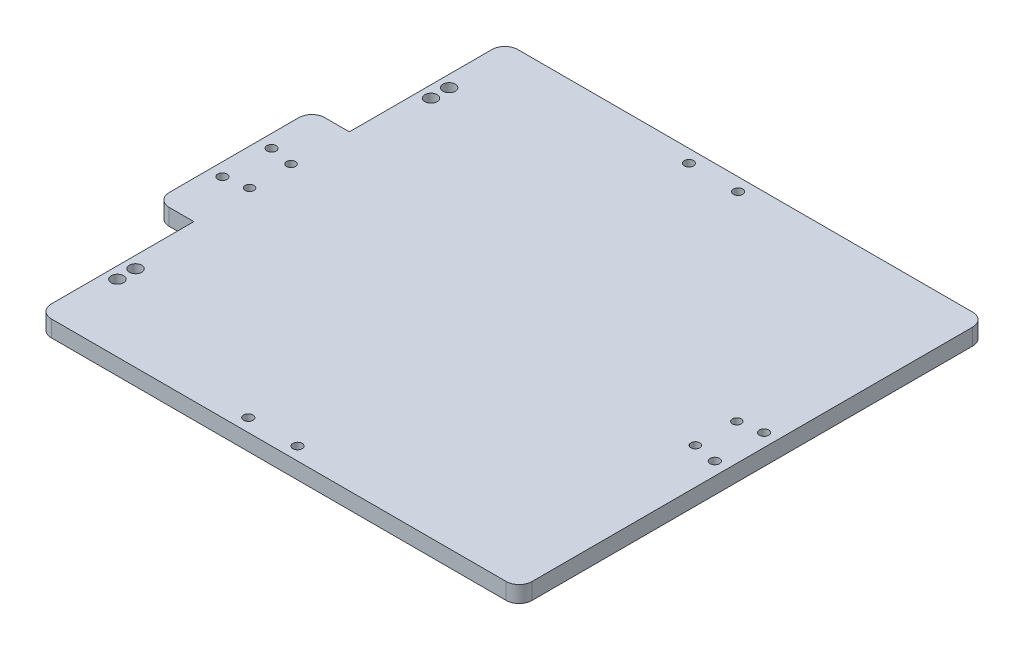
ISO-10303-21;
HEADER;
FILE_DESCRIPTION(('STEP AP214'),'2;1');
FILE_NAME('part.step','',(''),(''),'','','');
FILE_SCHEMA(('AUTOMOTIVE_DESIGN { 1 0 10303 214 1 1 1 1 }'));
ENDSEC;
DATA;
#1=APPLICATION_CONTEXT('core data for automotive mechanical design processes');
#2=APPLICATION_PROTOCOL_DEFINITION('international standard','automotive_design',2000,#1);
#3=PRODUCT_CONTEXT('',#1,'mechanical');
#4=PRODUCT('Part','Part','',(#3));
#5=PRODUCT_RELATED_PRODUCT_CATEGORY('part','',(#4));
#6=PRODUCT_DEFINITION_FORMATION('','',#4);
#7=PRODUCT_DEFINITION_CONTEXT('part definition',#1,'design');
#8=PRODUCT_DEFINITION('design','',#6,#7);
#9=PRODUCT_DEFINITION_SHAPE('','',#8);
#10=(LENGTH_UNIT() NAMED_UNIT(*) SI_UNIT(.MILLI.,.METRE.));
#11=(NAMED_UNIT(*) PLANE_ANGLE_UNIT() SI_UNIT($,.RADIAN.));
#12=(NAMED_UNIT(*) SI_UNIT($,.STERADIAN.) SOLID_ANGLE_UNIT());
#13=UNCERTAINTY_MEASURE_WITH_UNIT(LENGTH_MEASURE(1.E-05),#10,'distance_accuracy_value','');
#14=(GEOMETRIC_REPRESENTATION_CONTEXT(3) GLOBAL_UNCERTAINTY_ASSIGNED_CONTEXT((#13)) GLOBAL_UNIT_ASSIGNED_CONTEXT((#10,
#11,#12)) REPRESENTATION_CONTEXT('',''));
#15=CARTESIAN_POINT('',(0.,0.,0.));
#16=DIRECTION('',(0.,0.,1.));
#17=DIRECTION('',(1.,0.,0.));
#18=AXIS2_PLACEMENT_3D('',#15,#16,#17);
#19=CARTESIAN_POINT('',(-85.5,6.35,0.));
#20=DIRECTION('',(-1.,0.,0.));
#21=DIRECTION('',(0.,0.,1.));
#22=AXIS2_PLACEMENT_3D('',#19,#20,#21);
#23=PLANE('',#22);
#24=DIRECTION('',(0.,0.,-1.));
#25=VECTOR('',#24,1.);
#26=CARTESIAN_POINT('',(-85.5,0.,0.));
#27=LINE('',#26,#25);
#28=CARTESIAN_POINT('',(-85.5,0.,85.));
#29=VERTEX_POINT('',#28);
#30=CARTESIAN_POINT('',(-85.5,0.,30.0040818145987));
#31=VERTEX_POINT('',#30);
#32=EDGE_CURVE('E255',#29,#31,#27,.T.);
#33=ORIENTED_EDGE('',*,*,#32,.F.);
#34=DIRECTION('',(0.,-1.,0.));
#35=VECTOR('',#34,1.);
#36=CARTESIAN_POINT('',(-85.5,6.35,85.));
#37=LINE('',#36,#35);
#38=CARTESIAN_POINT('',(-85.5,6.35,85.));
#39=VERTEX_POINT('',#38);
#40=EDGE_CURVE('E53',#29,#39,#37,.F.);
#41=ORIENTED_EDGE('',*,*,#40,.T.);
#42=DIRECTION('',(0.,0.,-1.));
#43=VECTOR('',#42,1.);
#44=CARTESIAN_POINT('',(-85.5,6.35,0.));
#45=LINE('',#44,#43);
#46=CARTESIAN_POINT('',(-85.5,6.35,30.0040818145987));
#47=VERTEX_POINT('',#46);
#48=EDGE_CURVE('E253',#39,#47,#45,.T.);
#49=ORIENTED_EDGE('',*,*,#48,.T.);
#50=DIRECTION('',(0.,-1.,0.));
#51=VECTOR('',#50,1.);
#52=CARTESIAN_POINT('',(-85.5,6.35,30.0040818145987));
#53=LINE('',#52,#51);
#54=EDGE_CURVE('E175',#47,#31,#53,.T.);
#55=ORIENTED_EDGE('',*,*,#54,.T.);
#56=EDGE_LOOP('',(#33,#41,#49,#55));
#57=FACE_BOUND('',#56,.T.);
#58=ADVANCED_FACE('F44',(#57),#23,.T.);
#59=CARTESIAN_POINT('',(0.,6.35,90.));
#60=DIRECTION('',(0.,0.,1.));
#61=DIRECTION('',(1.,0.,0.));
#62=AXIS2_PLACEMENT_3D('',#59,#60,#61);
#63=PLANE('',#62);
#64=DIRECTION('',(-1.,0.,0.));
#65=VECTOR('',#64,1.);
#66=CARTESIAN_POINT('',(0.,0.,90.));
#67=LINE('',#66,#65);
#68=CARTESIAN_POINT('',(95.,0.,90.));
#69=VERTEX_POINT('',#68);
#70=CARTESIAN_POINT('',(-80.5,0.,90.));
#71=VERTEX_POINT('',#70);
#72=EDGE_CURVE('E271',#69,#71,#67,.T.);
#73=ORIENTED_EDGE('',*,*,#72,.F.);
#74=DIRECTION('',(0.,-1.,0.));
#75=VECTOR('',#74,1.);
#76=CARTESIAN_POINT('',(95.,6.35,90.));
#77=LINE('',#76,#75);
#78=CARTESIAN_POINT('',(95.,6.35,90.));
#79=VERTEX_POINT('',#78);
#80=EDGE_CURVE('E246',#69,#79,#77,.F.);
#81=ORIENTED_EDGE('',*,*,#80,.T.);
#82=DIRECTION('',(-1.,0.,0.));
#83=VECTOR('',#82,1.);
#84=CARTESIAN_POINT('',(0.,6.35,90.));
#85=LINE('',#84,#83);
#86=CARTESIAN_POINT('',(-80.5,6.35,90.));
#87=VERTEX_POINT('',#86);
#88=EDGE_CURVE('E262',#79,#87,#85,.T.);
#89=ORIENTED_EDGE('',*,*,#88,.T.);
#90=DIRECTION('',(0.,-1.,0.));
#91=VECTOR('',#90,1.);
#92=CARTESIAN_POINT('',(-80.5,6.35,90.));
#93=LINE('',#92,#91);
#94=EDGE_CURVE('E242',#87,#71,#93,.T.);
#95=ORIENTED_EDGE('',*,*,#94,.T.);
#96=EDGE_LOOP('',(#73,#81,#89,#95));
#97=FACE_BOUND('',#96,.T.);
#98=ADVANCED_FACE('F270',(#97),#63,.T.);
#99=CARTESIAN_POINT('',(100.,6.35,0.));
#100=DIRECTION('',(-1.,0.,0.));
#101=DIRECTION('',(0.,0.,1.));
#102=AXIS2_PLACEMENT_3D('',#99,#100,#101);
#103=PLANE('',#102);
#104=DIRECTION('',(0.,0.,-1.));
#105=VECTOR('',#104,1.);
#106=CARTESIAN_POINT('',(100.,0.,0.));
#107=LINE('',#106,#105);
#108=CARTESIAN_POINT('',(100.,0.,85.));
#109=VERTEX_POINT('',#108);
#110=CARTESIAN_POINT('',(100.,0.,-85.));
#111=VERTEX_POINT('',#110);
#112=EDGE_CURVE('E279',#109,#111,#107,.T.);
#113=ORIENTED_EDGE('',*,*,#112,.T.);
#114=DIRECTION('',(0.,-1.,0.));
#115=VECTOR('',#114,1.);
#116=CARTESIAN_POINT('',(100.,6.35,-85.));
#117=LINE('',#116,#115);
#118=CARTESIAN_POINT('',(100.,6.35,-85.));
#119=VERTEX_POINT('',#118);
#120=EDGE_CURVE('E239',#111,#119,#117,.F.);
#121=ORIENTED_EDGE('',*,*,#120,.T.);
#122=DIRECTION('',(0.,0.,-1.));
#123=VECTOR('',#122,1.);
#124=CARTESIAN_POINT('',(100.,6.35,0.));
#125=LINE('',#124,#123);
#126=CARTESIAN_POINT('',(100.,6.35,85.));
#127=VERTEX_POINT('',#126);
#128=EDGE_CURVE('E373',#127,#119,#125,.T.);
#129=ORIENTED_EDGE('',*,*,#128,.F.);
#130=DIRECTION('',(0.,-1.,0.));
#131=VECTOR('',#130,1.);
#132=CARTESIAN_POINT('',(100.,0.,85.));
#133=LINE('',#132,#131);
#134=EDGE_CURVE('E235',#127,#109,#133,.T.);
#135=ORIENTED_EDGE('',*,*,#134,.T.);
#136=EDGE_LOOP('',(#113,#121,#129,#135));
#137=FACE_BOUND('',#136,.T.);
#138=ADVANCED_FACE('F468',(#137),#103,.F.);
#139=CARTESIAN_POINT('',(0.,6.35,-90.));
#140=DIRECTION('',(0.,0.,1.));
#141=DIRECTION('',(1.,0.,0.));
#142=AXIS2_PLACEMENT_3D('',#139,#140,#141);
#143=PLANE('',#142);
#144=DIRECTION('',(-1.,0.,0.));
#145=VECTOR('',#144,1.);
#146=CARTESIAN_POINT('',(0.,0.,-90.));
#147=LINE('',#146,#145);
#148=CARTESIAN_POINT('',(95.,0.,-90.));
#149=VERTEX_POINT('',#148);
#150=CARTESIAN_POINT('',(-80.5,0.,-90.));
#151=VERTEX_POINT('',#150);
#152=EDGE_CURVE('E284',#149,#151,#147,.T.);
#153=ORIENTED_EDGE('',*,*,#152,.T.);
#154=DIRECTION('',(0.,-1.,0.));
#155=VECTOR('',#154,1.);
#156=CARTESIAN_POINT('',(-80.5,6.35,-90.));
#157=LINE('',#156,#155);
#158=CARTESIAN_POINT('',(-80.5,6.35,-90.));
#159=VERTEX_POINT('',#158);
#160=EDGE_CURVE('E232',#151,#159,#157,.F.);
#161=ORIENTED_EDGE('',*,*,#160,.T.);
#162=DIRECTION('',(-1.,0.,0.));
#163=VECTOR('',#162,1.);
#164=CARTESIAN_POINT('',(0.,6.35,-90.));
#165=LINE('',#164,#163);
#166=CARTESIAN_POINT('',(95.,6.35,-90.));
#167=VERTEX_POINT('',#166);
#168=EDGE_CURVE('E157',#167,#159,#165,.T.);
#169=ORIENTED_EDGE('',*,*,#168,.F.);
#170=DIRECTION('',(0.,-1.,0.));
#171=VECTOR('',#170,1.);
#172=CARTESIAN_POINT('',(95.,6.35,-90.));
#173=LINE('',#172,#171);
#174=EDGE_CURVE('E228',#167,#149,#173,.T.);
#175=ORIENTED_EDGE('',*,*,#174,.T.);
#176=EDGE_LOOP('',(#153,#161,#169,#175));
#177=FACE_BOUND('',#176,.T.);
#178=ADVANCED_FACE('F473',(#177),#143,.F.);
#179=CARTESIAN_POINT('',(-85.5,6.35,0.));
#180=DIRECTION('',(1.,0.,0.));
#181=DIRECTION('',(0.,0.,-1.));
#182=AXIS2_PLACEMENT_3D('',#179,#180,#181);
#183=PLANE('',#182);
#184=DIRECTION('',(0.,0.,1.));
#185=VECTOR('',#184,1.);
#186=CARTESIAN_POINT('',(-85.5,6.35,0.));
#187=LINE('',#186,#185);
#188=CARTESIAN_POINT('',(-85.5,6.35,-85.));
#189=VERTEX_POINT('',#188);
#190=CARTESIAN_POINT('',(-85.5,6.35,-30.0040818145986));
#191=VERTEX_POINT('',#190);
#192=EDGE_CURVE('E146',#189,#191,#187,.T.);
#193=ORIENTED_EDGE('',*,*,#192,.F.);
#194=DIRECTION('',(0.,-1.,0.));
#195=VECTOR('',#194,1.);
#196=CARTESIAN_POINT('',(-85.5,6.35,-85.));
#197=LINE('',#196,#195);
#198=CARTESIAN_POINT('',(-85.5,0.,-85.));
#199=VERTEX_POINT('',#198);
#200=EDGE_CURVE('E225',#189,#199,#197,.T.);
#201=ORIENTED_EDGE('',*,*,#200,.T.);
#202=DIRECTION('',(0.,0.,1.));
#203=VECTOR('',#202,1.);
#204=CARTESIAN_POINT('',(-85.5,0.,0.));
#205=LINE('',#204,#203);
#206=CARTESIAN_POINT('',(-85.5,0.,-30.0040818145986));
#207=VERTEX_POINT('',#206);
#208=EDGE_CURVE('E171',#199,#207,#205,.T.);
#209=ORIENTED_EDGE('',*,*,#208,.T.);
#210=DIRECTION('',(0.,-1.,0.));
#211=VECTOR('',#210,1.);
#212=CARTESIAN_POINT('',(-85.5,6.35,-30.0040818145986));
#213=LINE('',#212,#211);
#214=EDGE_CURVE('E163',#191,#207,#213,.T.);
#215=ORIENTED_EDGE('',*,*,#214,.F.);
#216=EDGE_LOOP('',(#193,#201,#209,#215));
#217=FACE_BOUND('',#216,.T.);
#218=ADVANCED_FACE('F169',(#217),#183,.F.);
#219=CARTESIAN_POINT('',(0.,6.35,-30.0040818145987));
#220=DIRECTION('',(0.,0.,1.));
#221=DIRECTION('',(1.,0.,0.));
#222=AXIS2_PLACEMENT_3D('',#219,#220,#221);
#223=PLANE('',#222);
#224=DIRECTION('',(-1.,0.,0.));
#225=VECTOR('',#224,1.);
#226=CARTESIAN_POINT('',(0.,0.,-30.0040818145987));
#227=LINE('',#226,#225);
#228=CARTESIAN_POINT('',(-95.,0.,-30.0040818145986));
#229=VERTEX_POINT('',#228);
#230=EDGE_CURVE('E295',#207,#229,#227,.T.);
#231=ORIENTED_EDGE('',*,*,#230,.T.);
#232=DIRECTION('',(0.,-1.,0.));
#233=VECTOR('',#232,1.);
#234=CARTESIAN_POINT('',(-95.,6.35,-30.0040818145986));
#235=LINE('',#234,#233);
#236=CARTESIAN_POINT('',(-95.,6.35,-30.0040818145986));
#237=VERTEX_POINT('',#236);
#238=EDGE_CURVE('E165',#229,#237,#235,.F.);
#239=ORIENTED_EDGE('',*,*,#238,.T.);
#240=DIRECTION('',(-1.,0.,0.));
#241=VECTOR('',#240,1.);
#242=CARTESIAN_POINT('',(0.,6.35,-30.0040818145987));
#243=LINE('',#242,#241);
#244=EDGE_CURVE('E150',#191,#237,#243,.T.);
#245=ORIENTED_EDGE('',*,*,#244,.F.);
#246=ORIENTED_EDGE('',*,*,#214,.T.);
#247=EDGE_LOOP('',(#231,#239,#245,#246));
#248=FACE_BOUND('',#247,.T.);
#249=ADVANCED_FACE('F162',(#248),#223,.F.);
#250=CARTESIAN_POINT('',(-100.,6.35,0.));
#251=DIRECTION('',(-1.,0.,0.));
#252=DIRECTION('',(0.,0.,1.));
#253=AXIS2_PLACEMENT_3D('',#250,#251,#252);
#254=PLANE('',#253);
#255=DIRECTION('',(0.,0.,-1.));
#256=VECTOR('',#255,1.);
#257=CARTESIAN_POINT('',(-100.,6.35,0.));
#258=LINE('',#257,#256);
#259=CARTESIAN_POINT('',(-100.,6.35,25.0040818145987));
#260=VERTEX_POINT('',#259);
#261=CARTESIAN_POINT('',(-100.,6.35,-25.0040818145986));
#262=VERTEX_POINT('',#261);
#263=EDGE_CURVE('E167',#260,#262,#258,.T.);
#264=ORIENTED_EDGE('',*,*,#263,.T.);
#265=DIRECTION('',(0.,-1.,0.));
#266=VECTOR('',#265,1.);
#267=CARTESIAN_POINT('',(-100.,0.,-25.0040818145986));
#268=LINE('',#267,#266);
#269=CARTESIAN_POINT('',(-100.,0.,-25.0040818145986));
#270=VERTEX_POINT('',#269);
#271=EDGE_CURVE('E179',#262,#270,#268,.T.);
#272=ORIENTED_EDGE('',*,*,#271,.T.);
#273=DIRECTION('',(0.,0.,-1.));
#274=VECTOR('',#273,1.);
#275=CARTESIAN_POINT('',(-100.,0.,0.));
#276=LINE('',#275,#274);
#277=CARTESIAN_POINT('',(-100.,0.,25.0040818145987));
#278=VERTEX_POINT('',#277);
#279=EDGE_CURVE('E298',#278,#270,#276,.T.);
#280=ORIENTED_EDGE('',*,*,#279,.F.);
#281=DIRECTION('',(0.,-1.,0.));
#282=VECTOR('',#281,1.);
#283=CARTESIAN_POINT('',(-100.,6.35,25.0040818145987));
#284=LINE('',#283,#282);
#285=EDGE_CURVE('E174',#278,#260,#284,.F.);
#286=ORIENTED_EDGE('',*,*,#285,.T.);
#287=EDGE_LOOP('',(#264,#272,#280,#286));
#288=FACE_BOUND('',#287,.T.);
#289=ADVANCED_FACE('F482',(#288),#254,.T.);
#290=CARTESIAN_POINT('',(86.,6.35,-8.00000000000002));
#291=DIRECTION('',(0.,-1.,0.));
#292=DIRECTION('',(0.,0.,-1.));
#293=AXIS2_PLACEMENT_3D('',#290,#291,#292);
#294=CYLINDRICAL_SURFACE('',#293,1.7);
#295=CARTESIAN_POINT('',(86.,6.35,-8.00000000000002));
#296=DIRECTION('',(0.,1.,0.));
#297=DIRECTION('',(0.,0.,1.));
#298=AXIS2_PLACEMENT_3D('',#295,#296,#297);
#299=CIRCLE('',#298,1.7);
#300=CARTESIAN_POINT('',(86.,6.35,-6.30000000000002));
#301=VERTEX_POINT('',#300);
#302=EDGE_CURVE('E400',#301,#301,#299,.F.);
#303=ORIENTED_EDGE('',*,*,#302,.F.);
#304=EDGE_LOOP('',(#303));
#305=FACE_BOUND('',#304,.T.);
#306=CARTESIAN_POINT('',(86.,0.,-8.00000000000002));
#307=DIRECTION('',(0.,1.,0.));
#308=DIRECTION('',(0.,0.,1.));
#309=AXIS2_PLACEMENT_3D('',#306,#307,#308);
#310=CIRCLE('',#309,1.7);
#311=CARTESIAN_POINT('',(86.,0.,-6.30000000000002));
#312=VERTEX_POINT('',#311);
#313=EDGE_CURVE('E321',#312,#312,#310,.F.);
#314=ORIENTED_EDGE('',*,*,#313,.T.);
#315=EDGE_LOOP('',(#314));
#316=FACE_BOUND('',#315,.T.);
#317=ADVANCED_FACE('F484',(#305,#316),#294,.F.);
#318=CARTESIAN_POINT('',(86.,6.35,7.99999999999998));
#319=DIRECTION('',(0.,-1.,0.));
#320=DIRECTION('',(0.,0.,-1.));
#321=AXIS2_PLACEMENT_3D('',#318,#319,#320);
#322=CYLINDRICAL_SURFACE('',#321,1.7);
#323=CARTESIAN_POINT('',(86.,6.35,7.99999999999998));
#324=DIRECTION('',(0.,1.,0.));
#325=DIRECTION('',(0.,0.,1.));
#326=AXIS2_PLACEMENT_3D('',#323,#324,#325);
#327=CIRCLE('',#326,1.7);
#328=CARTESIAN_POINT('',(86.,6.35,9.69999999999998));
#329=VERTEX_POINT('',#328);
#330=EDGE_CURVE('E396',#329,#329,#327,.T.);
#331=ORIENTED_EDGE('',*,*,#330,.T.);
#332=EDGE_LOOP('',(#331));
#333=FACE_BOUND('',#332,.T.);
#334=CARTESIAN_POINT('',(86.,0.,7.99999999999998));
#335=DIRECTION('',(0.,1.,0.));
#336=DIRECTION('',(0.,0.,1.));
#337=AXIS2_PLACEMENT_3D('',#334,#335,#336);
#338=CIRCLE('',#337,1.7);
#339=CARTESIAN_POINT('',(86.,0.,9.69999999999998));
#340=VERTEX_POINT('',#339);
#341=EDGE_CURVE('E317',#340,#340,#338,.T.);
#342=ORIENTED_EDGE('',*,*,#341,.F.);
#343=EDGE_LOOP('',(#342));
#344=FACE_BOUND('',#343,.T.);
#345=ADVANCED_FACE('F497',(#333,#344),#322,.F.);
#346=CARTESIAN_POINT('',(-95.,6.35,-9.49999999999998));
#347=DIRECTION('',(0.,-1.,0.));
#348=DIRECTION('',(0.,0.,-1.));
#349=AXIS2_PLACEMENT_3D('',#346,#347,#348);
#350=CYLINDRICAL_SURFACE('',#349,1.79999999999999);
#351=CARTESIAN_POINT('',(-95.,6.35,-9.49999999999998));
#352=DIRECTION('',(0.,1.,0.));
#353=DIRECTION('',(0.,0.,1.));
#354=AXIS2_PLACEMENT_3D('',#351,#352,#353);
#355=CIRCLE('',#354,1.79999999999999);
#356=CARTESIAN_POINT('',(-95.,6.35,-7.69999999999998));
#357=VERTEX_POINT('',#356);
#358=EDGE_CURVE('E392',#357,#357,#355,.F.);
#359=ORIENTED_EDGE('',*,*,#358,.F.);
#360=EDGE_LOOP('',(#359));
#361=FACE_BOUND('',#360,.T.);
#362=CARTESIAN_POINT('',(-95.,0.,-9.49999999999998));
#363=DIRECTION('',(0.,1.,0.));
#364=DIRECTION('',(0.,0.,1.));
#365=AXIS2_PLACEMENT_3D('',#362,#363,#364);
#366=CIRCLE('',#365,1.79999999999999);
#367=CARTESIAN_POINT('',(-95.,0.,-7.69999999999998));
#368=VERTEX_POINT('',#367);
#369=EDGE_CURVE('E313',#368,#368,#366,.F.);
#370=ORIENTED_EDGE('',*,*,#369,.T.);
#371=EDGE_LOOP('',(#370));
#372=FACE_BOUND('',#371,.T.);
#373=ADVANCED_FACE('F493',(#361,#372),#350,.F.);
#374=CARTESIAN_POINT('',(9.5,6.35,-85.));
#375=DIRECTION('',(0.,-1.,0.));
#376=DIRECTION('',(0.,0.,-1.));
#377=AXIS2_PLACEMENT_3D('',#374,#375,#376);
#378=CYLINDRICAL_SURFACE('',#377,1.8);
#379=CARTESIAN_POINT('',(9.5,6.35,-85.));
#380=DIRECTION('',(0.,1.,0.));
#381=DIRECTION('',(0.,0.,1.));
#382=AXIS2_PLACEMENT_3D('',#379,#380,#381);
#383=CIRCLE('',#382,1.8);
#384=CARTESIAN_POINT('',(9.5,6.35,-83.2));
#385=VERTEX_POINT('',#384);
#386=EDGE_CURVE('E388',#385,#385,#383,.F.);
#387=ORIENTED_EDGE('',*,*,#386,.F.);
#388=EDGE_LOOP('',(#387));
#389=FACE_BOUND('',#388,.T.);
#390=CARTESIAN_POINT('',(9.5,0.,-85.));
#391=DIRECTION('',(0.,1.,0.));
#392=DIRECTION('',(0.,0.,1.));
#393=AXIS2_PLACEMENT_3D('',#390,#391,#392);
#394=CIRCLE('',#393,1.8);
#395=CARTESIAN_POINT('',(9.5,0.,-83.2));
#396=VERTEX_POINT('',#395);
#397=EDGE_CURVE('E309',#396,#396,#394,.F.);
#398=ORIENTED_EDGE('',*,*,#397,.T.);
#399=EDGE_LOOP('',(#398));
#400=FACE_BOUND('',#399,.T.);
#401=ADVANCED_FACE('F489',(#389,#400),#378,.F.);
#402=CARTESIAN_POINT('',(9.50000000000004,6.35,85.));
#403=DIRECTION('',(0.,-1.,0.));
#404=DIRECTION('',(0.,0.,-1.));
#405=AXIS2_PLACEMENT_3D('',#402,#403,#404);
#406=CYLINDRICAL_SURFACE('',#405,1.8);
#407=CARTESIAN_POINT('',(9.50000000000004,6.35,85.));
#408=DIRECTION('',(0.,1.,0.));
#409=DIRECTION('',(0.,0.,1.));
#410=AXIS2_PLACEMENT_3D('',#407,#408,#409);
#411=CIRCLE('',#410,1.8);
#412=CARTESIAN_POINT('',(9.50000000000004,6.35,86.8));
#413=VERTEX_POINT('',#412);
#414=EDGE_CURVE('E384',#413,#413,#411,.T.);
#415=ORIENTED_EDGE('',*,*,#414,.T.);
#416=EDGE_LOOP('',(#415));
#417=FACE_BOUND('',#416,.T.);
#418=CARTESIAN_POINT('',(9.50000000000004,0.,85.));
#419=DIRECTION('',(0.,1.,0.));
#420=DIRECTION('',(0.,0.,1.));
#421=AXIS2_PLACEMENT_3D('',#418,#419,#420);
#422=CIRCLE('',#421,1.8);
#423=CARTESIAN_POINT('',(9.50000000000004,0.,86.8));
#424=VERTEX_POINT('',#423);
#425=EDGE_CURVE('E305',#424,#424,#422,.T.);
#426=ORIENTED_EDGE('',*,*,#425,.F.);
#427=EDGE_LOOP('',(#426));
#428=FACE_BOUND('',#427,.T.);
#429=ADVANCED_FACE('F460',(#417,#428),#406,.F.);
#430=CARTESIAN_POINT('',(0.,6.35,30.0040818145988));
#431=DIRECTION('',(0.,0.,1.));
#432=DIRECTION('',(1.,0.,0.));
#433=AXIS2_PLACEMENT_3D('',#430,#431,#432);
#434=PLANE('',#433);
#435=DIRECTION('',(-1.,0.,0.));
#436=VECTOR('',#435,1.);
#437=CARTESIAN_POINT('',(0.,6.35,30.0040818145988));
#438=LINE('',#437,#436);
#439=CARTESIAN_POINT('',(-95.,6.35,30.0040818145987));
#440=VERTEX_POINT('',#439);
#441=EDGE_CURVE('E260',#47,#440,#438,.T.);
#442=ORIENTED_EDGE('',*,*,#441,.T.);
#443=DIRECTION('',(0.,-1.,0.));
#444=VECTOR('',#443,1.);
#445=CARTESIAN_POINT('',(-95.,6.35,30.0040818145987));
#446=LINE('',#445,#444);
#447=CARTESIAN_POINT('',(-95.,0.,30.0040818145987));
#448=VERTEX_POINT('',#447);
#449=EDGE_CURVE('E11',#440,#448,#446,.T.);
#450=ORIENTED_EDGE('',*,*,#449,.T.);
#451=DIRECTION('',(-1.,0.,0.));
#452=VECTOR('',#451,1.);
#453=CARTESIAN_POINT('',(0.,0.,30.0040818145988));
#454=LINE('',#453,#452);
#455=EDGE_CURVE('E301',#31,#448,#454,.T.);
#456=ORIENTED_EDGE('',*,*,#455,.F.);
#457=ORIENTED_EDGE('',*,*,#54,.F.);
#458=EDGE_LOOP('',(#442,#450,#456,#457));
#459=FACE_BOUND('',#458,.T.);
#460=ADVANCED_FACE('F450',(#459),#434,.T.);
#461=CARTESIAN_POINT('',(-9.5,6.35,-85.));
#462=DIRECTION('',(0.,-1.,0.));
#463=DIRECTION('',(0.,0.,-1.));
#464=AXIS2_PLACEMENT_3D('',#461,#462,#463);
#465=CYLINDRICAL_SURFACE('',#464,1.8);
#466=CARTESIAN_POINT('',(-9.5,6.35,-85.));
#467=DIRECTION('',(0.,1.,0.));
#468=DIRECTION('',(0.,0.,1.));
#469=AXIS2_PLACEMENT_3D('',#466,#467,#468);
#470=CIRCLE('',#469,1.8);
#471=CARTESIAN_POINT('',(-9.5,6.35,-83.2));
#472=VERTEX_POINT('',#471);
#473=EDGE_CURVE('E263',#472,#472,#470,.T.);
#474=ORIENTED_EDGE('',*,*,#473,.T.);
#475=EDGE_LOOP('',(#474));
#476=FACE_BOUND('',#475,.T.);
#477=CARTESIAN_POINT('',(-9.5,0.,-85.));
#478=DIRECTION('',(0.,1.,0.));
#479=DIRECTION('',(0.,0.,1.));
#480=AXIS2_PLACEMENT_3D('',#477,#478,#479);
#481=CIRCLE('',#480,1.8);
#482=CARTESIAN_POINT('',(-9.5,0.,-83.2));
#483=VERTEX_POINT('',#482);
#484=EDGE_CURVE('E286',#483,#483,#481,.T.);
#485=ORIENTED_EDGE('',*,*,#484,.F.);
#486=EDGE_LOOP('',(#485));
#487=FACE_BOUND('',#486,.T.);
#488=ADVANCED_FACE('F447',(#476,#487),#465,.F.);
#489=CARTESIAN_POINT('',(-9.5,6.35,85.));
#490=DIRECTION('',(0.,-1.,0.));
#491=DIRECTION('',(0.,0.,-1.));
#492=AXIS2_PLACEMENT_3D('',#489,#490,#491);
#493=CYLINDRICAL_SURFACE('',#492,1.8);
#494=CARTESIAN_POINT('',(-9.5,6.35,85.));
#495=DIRECTION('',(0.,1.,0.));
#496=DIRECTION('',(0.,0.,1.));
#497=AXIS2_PLACEMENT_3D('',#494,#495,#496);
#498=CIRCLE('',#497,1.8);
#499=CARTESIAN_POINT('',(-9.5,6.35,86.8));
#500=VERTEX_POINT('',#499);
#501=EDGE_CURVE('E364',#500,#500,#498,.F.);
#502=ORIENTED_EDGE('',*,*,#501,.F.);
#503=EDGE_LOOP('',(#502));
#504=FACE_BOUND('',#503,.T.);
#505=CARTESIAN_POINT('',(-9.5,0.,85.));
#506=DIRECTION('',(0.,1.,0.));
#507=DIRECTION('',(0.,0.,1.));
#508=AXIS2_PLACEMENT_3D('',#505,#506,#507);
#509=CIRCLE('',#508,1.8);
#510=CARTESIAN_POINT('',(-9.5,0.,86.8));
#511=VERTEX_POINT('',#510);
#512=EDGE_CURVE('E439',#511,#511,#509,.F.);
#513=ORIENTED_EDGE('',*,*,#512,.T.);
#514=EDGE_LOOP('',(#513));
#515=FACE_BOUND('',#514,.T.);
#516=ADVANCED_FACE('F449',(#504,#515),#493,.F.);
#517=CARTESIAN_POINT('',(95.,6.35,-9.5));
#518=DIRECTION('',(0.,-1.,0.));
#519=DIRECTION('',(0.,0.,-1.));
#520=AXIS2_PLACEMENT_3D('',#517,#518,#519);
#521=CYLINDRICAL_SURFACE('',#520,1.79999999999999);
#522=CARTESIAN_POINT('',(95.,6.35,-9.5));
#523=DIRECTION('',(0.,1.,0.));
#524=DIRECTION('',(0.,0.,1.));
#525=AXIS2_PLACEMENT_3D('',#522,#523,#524);
#526=CIRCLE('',#525,1.79999999999999);
#527=CARTESIAN_POINT('',(95.,6.35,-7.70000000000001));
#528=VERTEX_POINT('',#527);
#529=EDGE_CURVE('E360',#528,#528,#526,.T.);
#530=ORIENTED_EDGE('',*,*,#529,.T.);
#531=EDGE_LOOP('',(#530));
#532=FACE_BOUND('',#531,.T.);
#533=CARTESIAN_POINT('',(95.,0.,-9.5));
#534=DIRECTION('',(0.,1.,0.));
#535=DIRECTION('',(0.,0.,1.));
#536=AXIS2_PLACEMENT_3D('',#533,#534,#535);
#537=CIRCLE('',#536,1.79999999999999);
#538=CARTESIAN_POINT('',(95.,0.,-7.70000000000001));
#539=VERTEX_POINT('',#538);
#540=EDGE_CURVE('E435',#539,#539,#537,.T.);
#541=ORIENTED_EDGE('',*,*,#540,.F.);
#542=EDGE_LOOP('',(#541));
#543=FACE_BOUND('',#542,.T.);
#544=ADVANCED_FACE('F457',(#532,#543),#521,.F.);
#545=CARTESIAN_POINT('',(95.,6.35,9.5));
#546=DIRECTION('',(0.,-1.,0.));
#547=DIRECTION('',(0.,0.,-1.));
#548=AXIS2_PLACEMENT_3D('',#545,#546,#547);
#549=CYLINDRICAL_SURFACE('',#548,1.79999999999999);
#550=CARTESIAN_POINT('',(95.,6.35,9.5));
#551=DIRECTION('',(0.,1.,0.));
#552=DIRECTION('',(0.,0.,1.));
#553=AXIS2_PLACEMENT_3D('',#550,#551,#552);
#554=CIRCLE('',#553,1.79999999999999);
#555=CARTESIAN_POINT('',(95.,6.35,11.3));
#556=VERTEX_POINT('',#555);
#557=EDGE_CURVE('E356',#556,#556,#554,.F.);
#558=ORIENTED_EDGE('',*,*,#557,.F.);
#559=EDGE_LOOP('',(#558));
#560=FACE_BOUND('',#559,.T.);
#561=CARTESIAN_POINT('',(95.,0.,9.5));
#562=DIRECTION('',(0.,1.,0.));
#563=DIRECTION('',(0.,0.,1.));
#564=AXIS2_PLACEMENT_3D('',#561,#562,#563);
#565=CIRCLE('',#564,1.79999999999999);
#566=CARTESIAN_POINT('',(95.,0.,11.3));
#567=VERTEX_POINT('',#566);
#568=EDGE_CURVE('E431',#567,#567,#565,.F.);
#569=ORIENTED_EDGE('',*,*,#568,.T.);
#570=EDGE_LOOP('',(#569));
#571=FACE_BOUND('',#570,.T.);
#572=ADVANCED_FACE('F541',(#560,#571),#549,.F.);
#573=CARTESIAN_POINT('',(-95.,6.35,9.50000000000002));
#574=DIRECTION('',(0.,-1.,0.));
#575=DIRECTION('',(0.,0.,-1.));
#576=AXIS2_PLACEMENT_3D('',#573,#574,#575);
#577=CYLINDRICAL_SURFACE('',#576,1.79999999999999);
#578=CARTESIAN_POINT('',(-95.,6.35,9.50000000000002));
#579=DIRECTION('',(0.,1.,0.));
#580=DIRECTION('',(0.,0.,1.));
#581=AXIS2_PLACEMENT_3D('',#578,#579,#580);
#582=CIRCLE('',#581,1.79999999999999);
#583=CARTESIAN_POINT('',(-95.,6.35,11.3));
#584=VERTEX_POINT('',#583);
#585=EDGE_CURVE('E352',#584,#584,#582,.T.);
#586=ORIENTED_EDGE('',*,*,#585,.T.);
#587=EDGE_LOOP('',(#586));
#588=FACE_BOUND('',#587,.T.);
#589=CARTESIAN_POINT('',(-95.,0.,9.50000000000002));
#590=DIRECTION('',(0.,1.,0.));
#591=DIRECTION('',(0.,0.,1.));
#592=AXIS2_PLACEMENT_3D('',#589,#590,#591);
#593=CIRCLE('',#592,1.79999999999999);
#594=CARTESIAN_POINT('',(-95.,0.,11.3));
#595=VERTEX_POINT('',#594);
#596=EDGE_CURVE('E427',#595,#595,#593,.T.);
#597=ORIENTED_EDGE('',*,*,#596,.F.);
#598=EDGE_LOOP('',(#597));
#599=FACE_BOUND('',#598,.T.);
#600=ADVANCED_FACE('F548',(#588,#599),#577,.F.);
#601=CARTESIAN_POINT('',(-86.,6.35,-8.));
#602=DIRECTION('',(0.,-1.,0.));
#603=DIRECTION('',(0.,0.,-1.));
#604=AXIS2_PLACEMENT_3D('',#601,#602,#603);
#605=CYLINDRICAL_SURFACE('',#604,1.7);
#606=CARTESIAN_POINT('',(-86.,6.35,-8.));
#607=DIRECTION('',(0.,1.,0.));
#608=DIRECTION('',(0.,0.,1.));
#609=AXIS2_PLACEMENT_3D('',#606,#607,#608);
#610=CIRCLE('',#609,1.7);
#611=CARTESIAN_POINT('',(-86.,6.35,-6.3));
#612=VERTEX_POINT('',#611);
#613=EDGE_CURVE('E348',#612,#612,#610,.T.);
#614=ORIENTED_EDGE('',*,*,#613,.T.);
#615=EDGE_LOOP('',(#614));
#616=FACE_BOUND('',#615,.T.);
#617=CARTESIAN_POINT('',(-86.,0.,-8.));
#618=DIRECTION('',(0.,1.,0.));
#619=DIRECTION('',(0.,0.,1.));
#620=AXIS2_PLACEMENT_3D('',#617,#618,#619);
#621=CIRCLE('',#620,1.7);
#622=CARTESIAN_POINT('',(-86.,0.,-6.3));
#623=VERTEX_POINT('',#622);
#624=EDGE_CURVE('E423',#623,#623,#621,.T.);
#625=ORIENTED_EDGE('',*,*,#624,.F.);
#626=EDGE_LOOP('',(#625));
#627=FACE_BOUND('',#626,.T.);
#628=ADVANCED_FACE('F554',(#616,#627),#605,.F.);
#629=CARTESIAN_POINT('',(-86.,6.35,8.));
#630=DIRECTION('',(0.,-1.,0.));
#631=DIRECTION('',(0.,0.,-1.));
#632=AXIS2_PLACEMENT_3D('',#629,#630,#631);
#633=CYLINDRICAL_SURFACE('',#632,1.7);
#634=CARTESIAN_POINT('',(-86.,6.35,8.));
#635=DIRECTION('',(0.,1.,0.));
#636=DIRECTION('',(0.,0.,1.));
#637=AXIS2_PLACEMENT_3D('',#634,#635,#636);
#638=CIRCLE('',#637,1.7);
#639=CARTESIAN_POINT('',(-86.,6.35,9.7));
#640=VERTEX_POINT('',#639);
#641=EDGE_CURVE('E344',#640,#640,#638,.F.);
#642=ORIENTED_EDGE('',*,*,#641,.F.);
#643=EDGE_LOOP('',(#642));
#644=FACE_BOUND('',#643,.T.);
#645=CARTESIAN_POINT('',(-86.,0.,8.));
#646=DIRECTION('',(0.,1.,0.));
#647=DIRECTION('',(0.,0.,1.));
#648=AXIS2_PLACEMENT_3D('',#645,#646,#647);
#649=CIRCLE('',#648,1.7);
#650=CARTESIAN_POINT('',(-86.,0.,9.7));
#651=VERTEX_POINT('',#650);
#652=EDGE_CURVE('E419',#651,#651,#649,.F.);
#653=ORIENTED_EDGE('',*,*,#652,.T.);
#654=EDGE_LOOP('',(#653));
#655=FACE_BOUND('',#654,.T.);
#656=ADVANCED_FACE('F558',(#644,#655),#633,.F.);
#657=CARTESIAN_POINT('',(-81.,6.35,-64.));
#658=DIRECTION('',(0.,-1.,0.));
#659=DIRECTION('',(0.,0.,-1.));
#660=AXIS2_PLACEMENT_3D('',#657,#658,#659);
#661=CYLINDRICAL_SURFACE('',#660,2.38125);
#662=CARTESIAN_POINT('',(-81.,6.35,-64.));
#663=DIRECTION('',(0.,1.,0.));
#664=DIRECTION('',(0.,0.,1.));
#665=AXIS2_PLACEMENT_3D('',#662,#663,#664);
#666=CIRCLE('',#665,2.38125);
#667=CARTESIAN_POINT('',(-81.,6.35,-61.61875));
#668=VERTEX_POINT('',#667);
#669=EDGE_CURVE('E338',#668,#668,#666,.T.);
#670=ORIENTED_EDGE('',*,*,#669,.T.);
#671=EDGE_LOOP('',(#670));
#672=FACE_BOUND('',#671,.T.);
#673=CARTESIAN_POINT('',(-81.,0.,-64.));
#674=DIRECTION('',(0.,1.,0.));
#675=DIRECTION('',(0.,0.,1.));
#676=AXIS2_PLACEMENT_3D('',#673,#674,#675);
#677=CIRCLE('',#676,2.38125);
#678=CARTESIAN_POINT('',(-81.,0.,-61.61875));
#679=VERTEX_POINT('',#678);
#680=EDGE_CURVE('E415',#679,#679,#677,.T.);
#681=ORIENTED_EDGE('',*,*,#680,.F.);
#682=EDGE_LOOP('',(#681));
#683=FACE_BOUND('',#682,.T.);
#684=ADVANCED_FACE('F562',(#672,#683),#661,.F.);
#685=CARTESIAN_POINT('',(-81.,6.35,-57.));
#686=DIRECTION('',(0.,-1.,0.));
#687=DIRECTION('',(0.,0.,-1.));
#688=AXIS2_PLACEMENT_3D('',#685,#686,#687);
#689=CYLINDRICAL_SURFACE('',#688,2.38125);
#690=CARTESIAN_POINT('',(-81.,6.35,-57.));
#691=DIRECTION('',(0.,1.,0.));
#692=DIRECTION('',(0.,0.,1.));
#693=AXIS2_PLACEMENT_3D('',#690,#691,#692);
#694=CIRCLE('',#693,2.38125);
#695=CARTESIAN_POINT('',(-81.,6.35,-54.61875));
#696=VERTEX_POINT('',#695);
#697=EDGE_CURVE('E332',#696,#696,#694,.T.);
#698=ORIENTED_EDGE('',*,*,#697,.T.);
#699=EDGE_LOOP('',(#698));
#700=FACE_BOUND('',#699,.T.);
#701=CARTESIAN_POINT('',(-81.,0.,-57.));
#702=DIRECTION('',(0.,1.,0.));
#703=DIRECTION('',(0.,0.,1.));
#704=AXIS2_PLACEMENT_3D('',#701,#702,#703);
#705=CIRCLE('',#704,2.38125);
#706=CARTESIAN_POINT('',(-81.,0.,-54.61875));
#707=VERTEX_POINT('',#706);
#708=EDGE_CURVE('E411',#707,#707,#705,.T.);
#709=ORIENTED_EDGE('',*,*,#708,.F.);
#710=EDGE_LOOP('',(#709));
#711=FACE_BOUND('',#710,.T.);
#712=ADVANCED_FACE('F566',(#700,#711),#689,.F.);
#713=CARTESIAN_POINT('',(-81.,6.35,57.0000000000001));
#714=DIRECTION('',(0.,-1.,0.));
#715=DIRECTION('',(0.,0.,-1.));
#716=AXIS2_PLACEMENT_3D('',#713,#714,#715);
#717=CYLINDRICAL_SURFACE('',#716,2.38125);
#718=CARTESIAN_POINT('',(-81.,6.35,57.0000000000001));
#719=DIRECTION('',(0.,1.,0.));
#720=DIRECTION('',(0.,0.,1.));
#721=AXIS2_PLACEMENT_3D('',#718,#719,#720);
#722=CIRCLE('',#721,2.38125);
#723=CARTESIAN_POINT('',(-81.,6.35,59.3812500000001));
#724=VERTEX_POINT('',#723);
#725=EDGE_CURVE('E327',#724,#724,#722,.F.);
#726=ORIENTED_EDGE('',*,*,#725,.F.);
#727=EDGE_LOOP('',(#726));
#728=FACE_BOUND('',#727,.T.);
#729=CARTESIAN_POINT('',(-81.,0.,57.0000000000001));
#730=DIRECTION('',(0.,1.,0.));
#731=DIRECTION('',(0.,0.,1.));
#732=AXIS2_PLACEMENT_3D('',#729,#730,#731);
#733=CIRCLE('',#732,2.38125);
#734=CARTESIAN_POINT('',(-81.,0.,59.3812500000001));
#735=VERTEX_POINT('',#734);
#736=EDGE_CURVE('E407',#735,#735,#733,.F.);
#737=ORIENTED_EDGE('',*,*,#736,.T.);
#738=EDGE_LOOP('',(#737));
#739=FACE_BOUND('',#738,.T.);
#740=ADVANCED_FACE('F508',(#728,#739),#717,.F.);
#741=CARTESIAN_POINT('',(-81.,6.35,64.0000000000001));
#742=DIRECTION('',(0.,-1.,0.));
#743=DIRECTION('',(0.,0.,-1.));
#744=AXIS2_PLACEMENT_3D('',#741,#742,#743);
#745=CYLINDRICAL_SURFACE('',#744,2.38125);
#746=CARTESIAN_POINT('',(-81.,6.35,64.0000000000001));
#747=DIRECTION('',(0.,1.,0.));
#748=DIRECTION('',(0.,0.,1.));
#749=AXIS2_PLACEMENT_3D('',#746,#747,#748);
#750=CIRCLE('',#749,2.38125);
#751=CARTESIAN_POINT('',(-81.,6.35,66.3812500000001));
#752=VERTEX_POINT('',#751);
#753=EDGE_CURVE('E182',#752,#752,#750,.F.);
#754=ORIENTED_EDGE('',*,*,#753,.F.);
#755=EDGE_LOOP('',(#754));
#756=FACE_BOUND('',#755,.T.);
#757=CARTESIAN_POINT('',(-81.,0.,64.0000000000001));
#758=DIRECTION('',(0.,1.,0.));
#759=DIRECTION('',(0.,0.,1.));
#760=AXIS2_PLACEMENT_3D('',#757,#758,#759);
#761=CIRCLE('',#760,2.38125);
#762=CARTESIAN_POINT('',(-81.,0.,66.3812500000001));
#763=VERTEX_POINT('',#762);
#764=EDGE_CURVE('E324',#763,#763,#761,.F.);
#765=ORIENTED_EDGE('',*,*,#764,.T.);
#766=EDGE_LOOP('',(#765));
#767=FACE_BOUND('',#766,.T.);
#768=ADVANCED_FACE('F505',(#756,#767),#745,.F.);
#769=CARTESIAN_POINT('',(0.,6.35,0.));
#770=DIRECTION('',(0.,1.,0.));
#771=DIRECTION('',(0.,0.,1.));
#772=AXIS2_PLACEMENT_3D('',#769,#770,#771);
#773=PLANE('',#772);
#774=ORIENTED_EDGE('',*,*,#725,.T.);
#775=EDGE_LOOP('',(#774));
#776=FACE_BOUND('',#775,.T.);
#777=ORIENTED_EDGE('',*,*,#697,.F.);
#778=EDGE_LOOP('',(#777));
#779=FACE_BOUND('',#778,.T.);
#780=ORIENTED_EDGE('',*,*,#669,.F.);
#781=EDGE_LOOP('',(#780));
#782=FACE_BOUND('',#781,.T.);
#783=ORIENTED_EDGE('',*,*,#641,.T.);
#784=EDGE_LOOP('',(#783));
#785=FACE_BOUND('',#784,.T.);
#786=ORIENTED_EDGE('',*,*,#613,.F.);
#787=EDGE_LOOP('',(#786));
#788=FACE_BOUND('',#787,.T.);
#789=ORIENTED_EDGE('',*,*,#585,.F.);
#790=EDGE_LOOP('',(#789));
#791=FACE_BOUND('',#790,.T.);
#792=ORIENTED_EDGE('',*,*,#557,.T.);
#793=EDGE_LOOP('',(#792));
#794=FACE_BOUND('',#793,.T.);
#795=ORIENTED_EDGE('',*,*,#529,.F.);
#796=EDGE_LOOP('',(#795));
#797=FACE_BOUND('',#796,.T.);
#798=ORIENTED_EDGE('',*,*,#501,.T.);
#799=EDGE_LOOP('',(#798));
#800=FACE_BOUND('',#799,.T.);
#801=ORIENTED_EDGE('',*,*,#473,.F.);
#802=EDGE_LOOP('',(#801));
#803=FACE_BOUND('',#802,.T.);
#804=ORIENTED_EDGE('',*,*,#244,.T.);
#805=CARTESIAN_POINT('',(-95.,6.35,-25.0040818145986));
#806=DIRECTION('',(0.,1.,0.));
#807=DIRECTION('',(0.,0.,1.));
#808=AXIS2_PLACEMENT_3D('',#805,#806,#807);
#809=CIRCLE('',#808,5.);
#810=EDGE_CURVE('E222',#237,#262,#809,.T.);
#811=ORIENTED_EDGE('',*,*,#810,.T.);
#812=ORIENTED_EDGE('',*,*,#263,.F.);
#813=CARTESIAN_POINT('',(-95.,6.35,25.0040818145987));
#814=DIRECTION('',(0.,1.,0.));
#815=DIRECTION('',(0.,0.,1.));
#816=AXIS2_PLACEMENT_3D('',#813,#814,#815);
#817=CIRCLE('',#816,5.);
#818=EDGE_CURVE('E60',#260,#440,#817,.T.);
#819=ORIENTED_EDGE('',*,*,#818,.T.);
#820=ORIENTED_EDGE('',*,*,#441,.F.);
#821=ORIENTED_EDGE('',*,*,#48,.F.);
#822=CARTESIAN_POINT('',(-80.5,6.35,85.));
#823=DIRECTION('',(0.,1.,0.));
#824=DIRECTION('',(0.,0.,1.));
#825=AXIS2_PLACEMENT_3D('',#822,#823,#824);
#826=CIRCLE('',#825,5.);
#827=EDGE_CURVE('E211',#39,#87,#826,.T.);
#828=ORIENTED_EDGE('',*,*,#827,.T.);
#829=ORIENTED_EDGE('',*,*,#88,.F.);
#830=CARTESIAN_POINT('',(95.,6.35,85.));
#831=DIRECTION('',(0.,1.,0.));
#832=DIRECTION('',(0.,0.,1.));
#833=AXIS2_PLACEMENT_3D('',#830,#831,#832);
#834=CIRCLE('',#833,5.);
#835=EDGE_CURVE('E214',#79,#127,#834,.T.);
#836=ORIENTED_EDGE('',*,*,#835,.T.);
#837=ORIENTED_EDGE('',*,*,#128,.T.);
#838=CARTESIAN_POINT('',(95.,6.35,-85.));
#839=DIRECTION('',(0.,1.,0.));
#840=DIRECTION('',(0.,0.,1.));
#841=AXIS2_PLACEMENT_3D('',#838,#839,#840);
#842=CIRCLE('',#841,5.);
#843=EDGE_CURVE('E217',#119,#167,#842,.T.);
#844=ORIENTED_EDGE('',*,*,#843,.T.);
#845=ORIENTED_EDGE('',*,*,#168,.T.);
#846=CARTESIAN_POINT('',(-80.5,6.35,-85.));
#847=DIRECTION('',(0.,1.,0.));
#848=DIRECTION('',(0.,0.,1.));
#849=AXIS2_PLACEMENT_3D('',#846,#847,#848);
#850=CIRCLE('',#849,5.);
#851=EDGE_CURVE('E67',#159,#189,#850,.T.);
#852=ORIENTED_EDGE('',*,*,#851,.T.);
#853=ORIENTED_EDGE('',*,*,#192,.T.);
#854=EDGE_LOOP('',(#804,#811,#812,#819,#820,#821,#828,#829,#836,#837,#844,#845,#852,#853));
#855=FACE_BOUND('',#854,.T.);
#856=ORIENTED_EDGE('',*,*,#414,.F.);
#857=EDGE_LOOP('',(#856));
#858=FACE_BOUND('',#857,.T.);
#859=ORIENTED_EDGE('',*,*,#386,.T.);
#860=EDGE_LOOP('',(#859));
#861=FACE_BOUND('',#860,.T.);
#862=ORIENTED_EDGE('',*,*,#358,.T.);
#863=EDGE_LOOP('',(#862));
#864=FACE_BOUND('',#863,.T.);
#865=ORIENTED_EDGE('',*,*,#330,.F.);
#866=EDGE_LOOP('',(#865));
#867=FACE_BOUND('',#866,.T.);
#868=ORIENTED_EDGE('',*,*,#302,.T.);
#869=EDGE_LOOP('',(#868));
#870=FACE_BOUND('',#869,.T.);
#871=ORIENTED_EDGE('',*,*,#753,.T.);
#872=EDGE_LOOP('',(#871));
#873=FACE_BOUND('',#872,.T.);
#874=ADVANCED_FACE('F148',(#776,#779,#782,#785,#788,#791,#794,#797,#800,#803,#855,#858,#861,
#864,#867,#870,#873),#773,.T.);
#875=CARTESIAN_POINT('',(0.,0.,0.));
#876=DIRECTION('',(0.,1.,0.));
#877=DIRECTION('',(0.,0.,1.));
#878=AXIS2_PLACEMENT_3D('',#875,#876,#877);
#879=PLANE('',#878);
#880=ORIENTED_EDGE('',*,*,#736,.F.);
#881=EDGE_LOOP('',(#880));
#882=FACE_BOUND('',#881,.T.);
#883=ORIENTED_EDGE('',*,*,#708,.T.);
#884=EDGE_LOOP('',(#883));
#885=FACE_BOUND('',#884,.T.);
#886=ORIENTED_EDGE('',*,*,#680,.T.);
#887=EDGE_LOOP('',(#886));
#888=FACE_BOUND('',#887,.T.);
#889=ORIENTED_EDGE('',*,*,#652,.F.);
#890=EDGE_LOOP('',(#889));
#891=FACE_BOUND('',#890,.T.);
#892=ORIENTED_EDGE('',*,*,#624,.T.);
#893=EDGE_LOOP('',(#892));
#894=FACE_BOUND('',#893,.T.);
#895=ORIENTED_EDGE('',*,*,#596,.T.);
#896=EDGE_LOOP('',(#895));
#897=FACE_BOUND('',#896,.T.);
#898=ORIENTED_EDGE('',*,*,#568,.F.);
#899=EDGE_LOOP('',(#898));
#900=FACE_BOUND('',#899,.T.);
#901=ORIENTED_EDGE('',*,*,#540,.T.);
#902=EDGE_LOOP('',(#901));
#903=FACE_BOUND('',#902,.T.);
#904=ORIENTED_EDGE('',*,*,#512,.F.);
#905=EDGE_LOOP('',(#904));
#906=FACE_BOUND('',#905,.T.);
#907=ORIENTED_EDGE('',*,*,#484,.T.);
#908=EDGE_LOOP('',(#907));
#909=FACE_BOUND('',#908,.T.);
#910=ORIENTED_EDGE('',*,*,#279,.T.);
#911=CARTESIAN_POINT('',(-95.,0.,-25.0040818145986));
#912=DIRECTION('',(0.,1.,0.));
#913=DIRECTION('',(0.,0.,1.));
#914=AXIS2_PLACEMENT_3D('',#911,#912,#913);
#915=CIRCLE('',#914,5.);
#916=EDGE_CURVE('E204',#270,#229,#915,.F.);
#917=ORIENTED_EDGE('',*,*,#916,.T.);
#918=ORIENTED_EDGE('',*,*,#230,.F.);
#919=ORIENTED_EDGE('',*,*,#208,.F.);
#920=CARTESIAN_POINT('',(-80.5,0.,-85.));
#921=DIRECTION('',(0.,1.,0.));
#922=DIRECTION('',(0.,0.,1.));
#923=AXIS2_PLACEMENT_3D('',#920,#921,#922);
#924=CIRCLE('',#923,5.);
#925=EDGE_CURVE('E201',#199,#151,#924,.F.);
#926=ORIENTED_EDGE('',*,*,#925,.T.);
#927=ORIENTED_EDGE('',*,*,#152,.F.);
#928=CARTESIAN_POINT('',(95.,0.,-85.));
#929=DIRECTION('',(0.,1.,0.));
#930=DIRECTION('',(0.,0.,1.));
#931=AXIS2_PLACEMENT_3D('',#928,#929,#930);
#932=CIRCLE('',#931,5.);
#933=EDGE_CURVE('E198',#149,#111,#932,.F.);
#934=ORIENTED_EDGE('',*,*,#933,.T.);
#935=ORIENTED_EDGE('',*,*,#112,.F.);
#936=CARTESIAN_POINT('',(95.,0.,85.));
#937=DIRECTION('',(0.,1.,0.));
#938=DIRECTION('',(0.,0.,1.));
#939=AXIS2_PLACEMENT_3D('',#936,#937,#938);
#940=CIRCLE('',#939,5.);
#941=EDGE_CURVE('E195',#109,#69,#940,.F.);
#942=ORIENTED_EDGE('',*,*,#941,.T.);
#943=ORIENTED_EDGE('',*,*,#72,.T.);
#944=CARTESIAN_POINT('',(-80.5,0.,85.));
#945=DIRECTION('',(0.,1.,0.));
#946=DIRECTION('',(0.,0.,1.));
#947=AXIS2_PLACEMENT_3D('',#944,#945,#946);
#948=CIRCLE('',#947,5.);
#949=EDGE_CURVE('E192',#71,#29,#948,.F.);
#950=ORIENTED_EDGE('',*,*,#949,.T.);
#951=ORIENTED_EDGE('',*,*,#32,.T.);
#952=ORIENTED_EDGE('',*,*,#455,.T.);
#953=CARTESIAN_POINT('',(-95.,0.,25.0040818145987));
#954=DIRECTION('',(0.,1.,0.));
#955=DIRECTION('',(0.,0.,1.));
#956=AXIS2_PLACEMENT_3D('',#953,#954,#955);
#957=CIRCLE('',#956,5.);
#958=EDGE_CURVE('E189',#448,#278,#957,.F.);
#959=ORIENTED_EDGE('',*,*,#958,.T.);
#960=EDGE_LOOP('',(#910,#917,#918,#919,#926,#927,#934,#935,#942,#943,#950,#951,#952,#959));
#961=FACE_BOUND('',#960,.T.);
#962=ORIENTED_EDGE('',*,*,#425,.T.);
#963=EDGE_LOOP('',(#962));
#964=FACE_BOUND('',#963,.T.);
#965=ORIENTED_EDGE('',*,*,#397,.F.);
#966=EDGE_LOOP('',(#965));
#967=FACE_BOUND('',#966,.T.);
#968=ORIENTED_EDGE('',*,*,#369,.F.);
#969=EDGE_LOOP('',(#968));
#970=FACE_BOUND('',#969,.T.);
#971=ORIENTED_EDGE('',*,*,#341,.T.);
#972=EDGE_LOOP('',(#971));
#973=FACE_BOUND('',#972,.T.);
#974=ORIENTED_EDGE('',*,*,#313,.F.);
#975=EDGE_LOOP('',(#974));
#976=FACE_BOUND('',#975,.T.);
#977=ORIENTED_EDGE('',*,*,#764,.F.);
#978=EDGE_LOOP('',(#977));
#979=FACE_BOUND('',#978,.T.);
#980=ADVANCED_FACE('F275',(#882,#885,#888,#891,#894,#897,#900,#903,#906,#909,#961,#964,#967,
#970,#973,#976,#979),#879,.F.);
#981=CARTESIAN_POINT('',(-95.,6.35,-25.0040818145986));
#982=DIRECTION('',(0.,1.,0.));
#983=DIRECTION('',(0.,0.,1.));
#984=AXIS2_PLACEMENT_3D('',#981,#982,#983);
#985=CYLINDRICAL_SURFACE('',#984,5.);
#986=ORIENTED_EDGE('',*,*,#810,.F.);
#987=ORIENTED_EDGE('',*,*,#238,.F.);
#988=ORIENTED_EDGE('',*,*,#916,.F.);
#989=ORIENTED_EDGE('',*,*,#271,.F.);
#990=EDGE_LOOP('',(#986,#987,#988,#989));
#991=FACE_BOUND('',#990,.T.);
#992=ADVANCED_FACE('F512',(#991),#985,.T.);
#993=CARTESIAN_POINT('',(-80.5,6.35,-85.));
#994=DIRECTION('',(0.,-1.,0.));
#995=DIRECTION('',(0.,0.,-1.));
#996=AXIS2_PLACEMENT_3D('',#993,#994,#995);
#997=CYLINDRICAL_SURFACE('',#996,5.);
#998=ORIENTED_EDGE('',*,*,#851,.F.);
#999=ORIENTED_EDGE('',*,*,#160,.F.);
#1000=ORIENTED_EDGE('',*,*,#925,.F.);
#1001=ORIENTED_EDGE('',*,*,#200,.F.);
#1002=EDGE_LOOP('',(#998,#999,#1000,#1001));
#1003=FACE_BOUND('',#1002,.T.);
#1004=ADVANCED_FACE('F576',(#1003),#997,.T.);
#1005=CARTESIAN_POINT('',(95.,6.35,-85.));
#1006=DIRECTION('',(0.,-1.,0.));
#1007=DIRECTION('',(0.,0.,-1.));
#1008=AXIS2_PLACEMENT_3D('',#1005,#1006,#1007);
#1009=CYLINDRICAL_SURFACE('',#1008,5.);
#1010=ORIENTED_EDGE('',*,*,#843,.F.);
#1011=ORIENTED_EDGE('',*,*,#120,.F.);
#1012=ORIENTED_EDGE('',*,*,#933,.F.);
#1013=ORIENTED_EDGE('',*,*,#174,.F.);
#1014=EDGE_LOOP('',(#1010,#1011,#1012,#1013));
#1015=FACE_BOUND('',#1014,.T.);
#1016=ADVANCED_FACE('F580',(#1015),#1009,.T.);
#1017=CARTESIAN_POINT('',(95.,6.35,85.));
#1018=DIRECTION('',(0.,1.,0.));
#1019=DIRECTION('',(0.,0.,1.));
#1020=AXIS2_PLACEMENT_3D('',#1017,#1018,#1019);
#1021=CYLINDRICAL_SURFACE('',#1020,5.);
#1022=ORIENTED_EDGE('',*,*,#835,.F.);
#1023=ORIENTED_EDGE('',*,*,#80,.F.);
#1024=ORIENTED_EDGE('',*,*,#941,.F.);
#1025=ORIENTED_EDGE('',*,*,#134,.F.);
#1026=EDGE_LOOP('',(#1022,#1023,#1024,#1025));
#1027=FACE_BOUND('',#1026,.T.);
#1028=ADVANCED_FACE('F584',(#1027),#1021,.T.);
#1029=CARTESIAN_POINT('',(-80.5,6.35,85.));
#1030=DIRECTION('',(0.,-1.,0.));
#1031=DIRECTION('',(0.,0.,-1.));
#1032=AXIS2_PLACEMENT_3D('',#1029,#1030,#1031);
#1033=CYLINDRICAL_SURFACE('',#1032,5.);
#1034=ORIENTED_EDGE('',*,*,#827,.F.);
#1035=ORIENTED_EDGE('',*,*,#40,.F.);
#1036=ORIENTED_EDGE('',*,*,#949,.F.);
#1037=ORIENTED_EDGE('',*,*,#94,.F.);
#1038=EDGE_LOOP('',(#1034,#1035,#1036,#1037));
#1039=FACE_BOUND('',#1038,.T.);
#1040=ADVANCED_FACE('F266',(#1039),#1033,.T.);
#1041=CARTESIAN_POINT('',(-95.,6.35,25.0040818145987));
#1042=DIRECTION('',(0.,-1.,0.));
#1043=DIRECTION('',(0.,0.,-1.));
#1044=AXIS2_PLACEMENT_3D('',#1041,#1042,#1043);
#1045=CYLINDRICAL_SURFACE('',#1044,5.);
#1046=ORIENTED_EDGE('',*,*,#818,.F.);
#1047=ORIENTED_EDGE('',*,*,#285,.F.);
#1048=ORIENTED_EDGE('',*,*,#958,.F.);
#1049=ORIENTED_EDGE('',*,*,#449,.F.);
#1050=EDGE_LOOP('',(#1046,#1047,#1048,#1049));
#1051=FACE_BOUND('',#1050,.T.);
#1052=ADVANCED_FACE('F46',(#1051),#1045,.T.);
#1053=CLOSED_SHELL('',(#58,#98,#138,#178,#218,#249,#289,#317,#345,#373,#401,#429,#460,#488,#516,
#544,#572,#600,#628,#656,#684,#712,#740,#768,#874,#980,#992,#1004,#1016,#1028,#1040,#1052));
#1054=MANIFOLD_SOLID_BREP('B2',#1053);
#1055=ADVANCED_BREP_SHAPE_REPRESENTATION('',(#18,#1054),#14);
#1056=SHAPE_DEFINITION_REPRESENTATION(#9,#1055);
ENDSEC;
END-ISO-10303-21;
